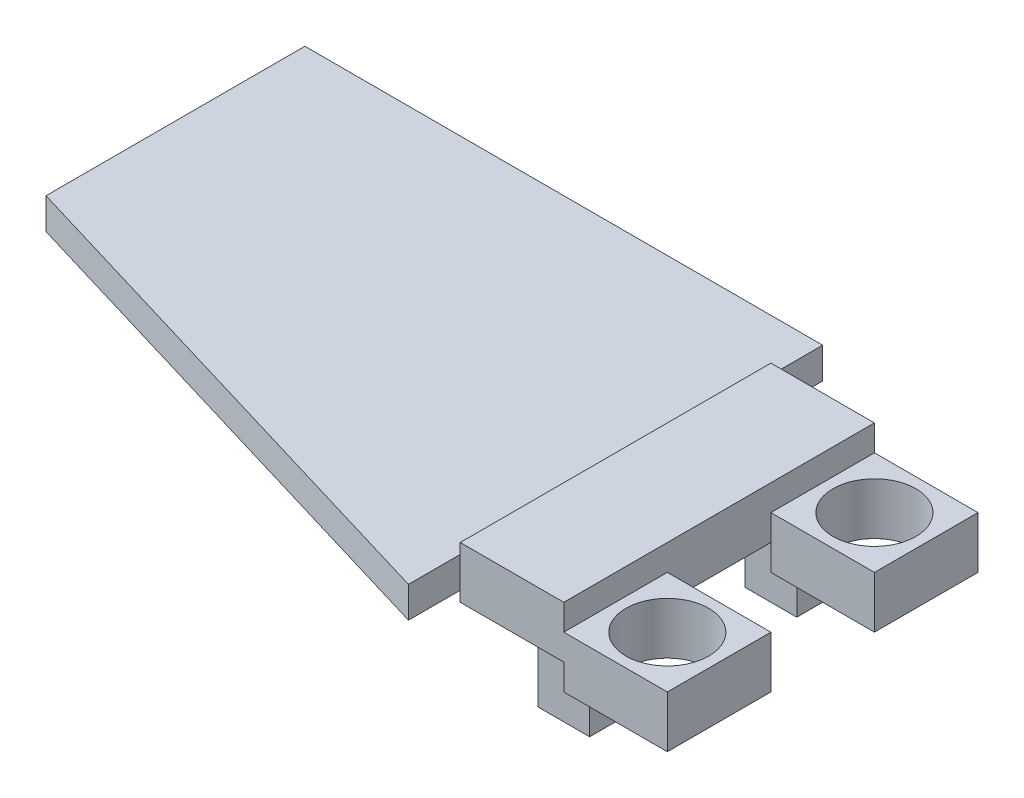
ISO-10303-21;
HEADER;
FILE_DESCRIPTION(('STEP AP214'),'2;1');
FILE_NAME('part.step','',(''),(''),'','','');
FILE_SCHEMA(('AUTOMOTIVE_DESIGN { 1 0 10303 214 1 1 1 1 }'));
ENDSEC;
DATA;
#1=APPLICATION_CONTEXT('core data for automotive mechanical design processes');
#2=APPLICATION_PROTOCOL_DEFINITION('international standard','automotive_design',2000,#1);
#3=PRODUCT_CONTEXT('',#1,'mechanical');
#4=PRODUCT('Part','Part','',(#3));
#5=PRODUCT_RELATED_PRODUCT_CATEGORY('part','',(#4));
#6=PRODUCT_DEFINITION_FORMATION('','',#4);
#7=PRODUCT_DEFINITION_CONTEXT('part definition',#1,'design');
#8=PRODUCT_DEFINITION('design','',#6,#7);
#9=PRODUCT_DEFINITION_SHAPE('','',#8);
#10=(LENGTH_UNIT() NAMED_UNIT(*) SI_UNIT(.MILLI.,.METRE.));
#11=(NAMED_UNIT(*) PLANE_ANGLE_UNIT() SI_UNIT($,.RADIAN.));
#12=(NAMED_UNIT(*) SI_UNIT($,.STERADIAN.) SOLID_ANGLE_UNIT());
#13=UNCERTAINTY_MEASURE_WITH_UNIT(LENGTH_MEASURE(1.E-05),#10,'distance_accuracy_value','');
#14=(GEOMETRIC_REPRESENTATION_CONTEXT(3) GLOBAL_UNCERTAINTY_ASSIGNED_CONTEXT((#13)) GLOBAL_UNIT_ASSIGNED_CONTEXT((#10,
#11,#12)) REPRESENTATION_CONTEXT('',''));
#15=CARTESIAN_POINT('',(0.,0.,0.));
#16=DIRECTION('',(0.,0.,1.));
#17=DIRECTION('',(1.,0.,0.));
#18=AXIS2_PLACEMENT_3D('',#15,#16,#17);
#19=CARTESIAN_POINT('',(-9.99999999999999,5.,-15.));
#20=DIRECTION('',(1.,0.,0.));
#21=DIRECTION('',(0.,0.,1.));
#22=AXIS2_PLACEMENT_3D('',#19,#20,#21);
#23=PLANE('',#22);
#24=DIRECTION('',(0.,0.,1.));
#25=VECTOR('',#24,1.);
#26=CARTESIAN_POINT('',(-10.,2.5,-25.));
#27=LINE('',#26,#25);
#28=CARTESIAN_POINT('',(-10.,2.5,-25.));
#29=VERTEX_POINT('',#28);
#30=CARTESIAN_POINT('',(-9.99999999999999,2.5,-22.5));
#31=VERTEX_POINT('',#30);
#32=EDGE_CURVE('E266',#29,#31,#27,.T.);
#33=ORIENTED_EDGE('',*,*,#32,.F.);
#34=DIRECTION('',(0.,-1.,0.));
#35=VECTOR('',#34,1.);
#36=CARTESIAN_POINT('',(-10.,5.,-25.));
#37=LINE('',#36,#35);
#38=CARTESIAN_POINT('',(-10.,0.,-25.));
#39=VERTEX_POINT('',#38);
#40=EDGE_CURVE('E454',#29,#39,#37,.T.);
#41=ORIENTED_EDGE('',*,*,#40,.T.);
#42=DIRECTION('',(0.,0.,-1.));
#43=VECTOR('',#42,1.);
#44=CARTESIAN_POINT('',(-9.99999999999999,0.,-15.));
#45=LINE('',#44,#43);
#46=CARTESIAN_POINT('',(-9.99999999999999,0.,-22.5));
#47=VERTEX_POINT('',#46);
#48=EDGE_CURVE('E447',#47,#39,#45,.T.);
#49=ORIENTED_EDGE('',*,*,#48,.F.);
#50=DIRECTION('',(0.,1.,0.));
#51=VECTOR('',#50,1.);
#52=CARTESIAN_POINT('',(-9.99999999999999,-5.,-22.5));
#53=LINE('',#52,#51);
#54=EDGE_CURVE('E354',#47,#31,#53,.T.);
#55=ORIENTED_EDGE('',*,*,#54,.T.);
#56=EDGE_LOOP('',(#33,#41,#49,#55));
#57=FACE_BOUND('',#56,.T.);
#58=ADVANCED_FACE('F39',(#57),#23,.F.);
#59=CARTESIAN_POINT('',(-9.99999999999999,2.5,-17.5));
#60=VERTEX_POINT('',#59);
#61=CARTESIAN_POINT('',(-9.99999999999999,2.5,-15.));
#62=VERTEX_POINT('',#61);
#63=EDGE_CURVE('E269',#60,#62,#27,.T.);
#64=ORIENTED_EDGE('',*,*,#63,.F.);
#65=DIRECTION('',(0.,-1.,0.));
#66=VECTOR('',#65,1.);
#67=CARTESIAN_POINT('',(-9.99999999999999,-5.,-17.5));
#68=LINE('',#67,#66);
#69=CARTESIAN_POINT('',(-9.99999999999999,0.,-17.5));
#70=VERTEX_POINT('',#69);
#71=EDGE_CURVE('E371',#60,#70,#68,.T.);
#72=ORIENTED_EDGE('',*,*,#71,.T.);
#73=CARTESIAN_POINT('',(-9.99999999999999,0.,-15.));
#74=VERTEX_POINT('',#73);
#75=EDGE_CURVE('E448',#74,#70,#45,.T.);
#76=ORIENTED_EDGE('',*,*,#75,.F.);
#77=DIRECTION('',(0.,-1.,0.));
#78=VECTOR('',#77,1.);
#79=CARTESIAN_POINT('',(-9.99999999999999,5.,-15.));
#80=LINE('',#79,#78);
#81=EDGE_CURVE('E457',#62,#74,#80,.T.);
#82=ORIENTED_EDGE('',*,*,#81,.F.);
#83=EDGE_LOOP('',(#64,#72,#76,#82));
#84=FACE_BOUND('',#83,.T.);
#85=ADVANCED_FACE('F550',(#84),#23,.F.);
#86=CARTESIAN_POINT('',(0.,3.5,0.));
#87=DIRECTION('',(0.,-1.,0.));
#88=DIRECTION('',(0.,0.,-1.));
#89=AXIS2_PLACEMENT_3D('',#86,#87,#88);
#90=PLANE('',#89);
#91=DIRECTION('',(0.,0.,-1.));
#92=VECTOR('',#91,1.);
#93=CARTESIAN_POINT('',(-19.9999999997544,3.5,291573.5));
#94=LINE('',#93,#92);
#95=CARTESIAN_POINT('',(-19.9999999999567,3.5,9.99999999993406));
#96=VERTEX_POINT('',#95);
#97=CARTESIAN_POINT('',(-19.9999999999818,3.5,4.99999999999545));
#98=VERTEX_POINT('',#97);
#99=EDGE_CURVE('E406',#96,#98,#94,.T.);
#100=ORIENTED_EDGE('',*,*,#99,.F.);
#101=DIRECTION('',(0.957826285221151,0.,0.287347885566345));
#102=VECTOR('',#101,1.);
#103=CARTESIAN_POINT('',(447203.899082569,3.5,134177.169724771));
#104=LINE('',#103,#102);
#105=CARTESIAN_POINT('',(-69.9999999999932,3.5,-5.0000000000523));
#106=VERTEX_POINT('',#105);
#107=EDGE_CURVE('E403',#106,#96,#104,.T.);
#108=ORIENTED_EDGE('',*,*,#107,.F.);
#109=DIRECTION('',(0.,0.,1.));
#110=VECTOR('',#109,1.);
#111=CARTESIAN_POINT('',(-69.9999999999932,3.5,291573.5));
#112=LINE('',#111,#110);
#113=CARTESIAN_POINT('',(-69.9999999999932,3.5,-29.9999999999727));
#114=VERTEX_POINT('',#113);
#115=EDGE_CURVE('E400',#114,#106,#112,.T.);
#116=ORIENTED_EDGE('',*,*,#115,.F.);
#117=DIRECTION('',(-1.,0.,0.));
#118=VECTOR('',#117,1.);
#119=CARTESIAN_POINT('',(399985.,3.5,-29.9999999999727));
#120=LINE('',#119,#118);
#121=CARTESIAN_POINT('',(-19.9999999999818,3.5,-29.9999999999727));
#122=VERTEX_POINT('',#121);
#123=EDGE_CURVE('E380',#122,#114,#120,.T.);
#124=ORIENTED_EDGE('',*,*,#123,.F.);
#125=DIRECTION('',(0.,0.,-1.));
#126=VECTOR('',#125,1.);
#127=CARTESIAN_POINT('',(-19.9999999999818,3.5,291573.5));
#128=LINE('',#127,#126);
#129=CARTESIAN_POINT('',(-19.9999999999818,3.5,-24.9999999999773));
#130=VERTEX_POINT('',#129);
#131=EDGE_CURVE('E385',#130,#122,#128,.T.);
#132=ORIENTED_EDGE('',*,*,#131,.F.);
#133=DIRECTION('',(0.,0.,-1.));
#134=VECTOR('',#133,1.);
#135=CARTESIAN_POINT('',(-20.,3.5,0.));
#136=LINE('',#135,#134);
#137=EDGE_CURVE('E351',#98,#130,#136,.T.);
#138=ORIENTED_EDGE('',*,*,#137,.F.);
#139=EDGE_LOOP('',(#100,#108,#116,#124,#132,#138));
#140=FACE_BOUND('',#139,.T.);
#141=ADVANCED_FACE('F552',(#140),#90,.T.);
#142=CARTESIAN_POINT('',(0.,6.5,0.));
#143=DIRECTION('',(0.,-1.,0.));
#144=DIRECTION('',(0.,0.,-1.));
#145=AXIS2_PLACEMENT_3D('',#142,#143,#144);
#146=PLANE('',#145);
#147=DIRECTION('',(0.,0.,-1.));
#148=VECTOR('',#147,1.);
#149=CARTESIAN_POINT('',(-20.,6.5,0.));
#150=LINE('',#149,#148);
#151=CARTESIAN_POINT('',(-20.,6.5,5.));
#152=VERTEX_POINT('',#151);
#153=CARTESIAN_POINT('',(-19.9999999999818,6.5,-24.9999999999773));
#154=VERTEX_POINT('',#153);
#155=EDGE_CURVE('E11',#152,#154,#150,.T.);
#156=ORIENTED_EDGE('',*,*,#155,.T.);
#157=DIRECTION('',(0.,0.,-1.));
#158=VECTOR('',#157,1.);
#159=CARTESIAN_POINT('',(-19.9999999999818,6.5,291573.5));
#160=LINE('',#159,#158);
#161=CARTESIAN_POINT('',(-19.9999999999818,6.5,-29.9999999999727));
#162=VERTEX_POINT('',#161);
#163=EDGE_CURVE('E394',#154,#162,#160,.T.);
#164=ORIENTED_EDGE('',*,*,#163,.T.);
#165=DIRECTION('',(-1.,0.,0.));
#166=VECTOR('',#165,1.);
#167=CARTESIAN_POINT('',(399985.,6.5,-29.9999999999727));
#168=LINE('',#167,#166);
#169=CARTESIAN_POINT('',(-69.9999999999932,6.5,-29.9999999999727));
#170=VERTEX_POINT('',#169);
#171=EDGE_CURVE('E381',#162,#170,#168,.T.);
#172=ORIENTED_EDGE('',*,*,#171,.T.);
#173=DIRECTION('',(0.,0.,1.));
#174=VECTOR('',#173,1.);
#175=CARTESIAN_POINT('',(-69.9999999999932,6.5,291573.5));
#176=LINE('',#175,#174);
#177=CARTESIAN_POINT('',(-69.9999999999932,6.5,-5.0000000000523));
#178=VERTEX_POINT('',#177);
#179=EDGE_CURVE('E384',#170,#178,#176,.T.);
#180=ORIENTED_EDGE('',*,*,#179,.T.);
#181=DIRECTION('',(0.957826285221151,0.,0.287347885566345));
#182=VECTOR('',#181,1.);
#183=CARTESIAN_POINT('',(447203.899082569,6.5,134177.169724771));
#184=LINE('',#183,#182);
#185=CARTESIAN_POINT('',(-19.9999999999567,6.5,9.99999999993406));
#186=VERTEX_POINT('',#185);
#187=EDGE_CURVE('E388',#178,#186,#184,.T.);
#188=ORIENTED_EDGE('',*,*,#187,.T.);
#189=DIRECTION('',(0.,0.,-1.));
#190=VECTOR('',#189,1.);
#191=CARTESIAN_POINT('',(-19.9999999997544,6.5,291573.5));
#192=LINE('',#191,#190);
#193=EDGE_CURVE('E391',#186,#152,#192,.T.);
#194=ORIENTED_EDGE('',*,*,#193,.T.);
#195=EDGE_LOOP('',(#156,#164,#172,#180,#188,#194));
#196=FACE_BOUND('',#195,.T.);
#197=ADVANCED_FACE('F558',(#196),#146,.F.);
#198=CARTESIAN_POINT('',(-15.,-5.,-22.5));
#199=DIRECTION('',(0.,0.,1.));
#200=DIRECTION('',(-1.,0.,0.));
#201=AXIS2_PLACEMENT_3D('',#198,#199,#200);
#202=PLANE('',#201);
#203=DIRECTION('',(1.,0.,0.));
#204=VECTOR('',#203,1.);
#205=CARTESIAN_POINT('',(-15.,2.5,-22.5));
#206=LINE('',#205,#204);
#207=CARTESIAN_POINT('',(-15.,2.5,-22.5));
#208=VERTEX_POINT('',#207);
#209=EDGE_CURVE('E349',#208,#31,#206,.T.);
#210=ORIENTED_EDGE('',*,*,#209,.T.);
#211=ORIENTED_EDGE('',*,*,#54,.F.);
#212=CARTESIAN_POINT('',(-9.99999999999999,-5.,-22.5));
#213=VERTEX_POINT('',#212);
#214=EDGE_CURVE('E365',#213,#47,#53,.T.);
#215=ORIENTED_EDGE('',*,*,#214,.F.);
#216=DIRECTION('',(1.,0.,0.));
#217=VECTOR('',#216,1.);
#218=CARTESIAN_POINT('',(-15.,-5.,-22.5));
#219=LINE('',#218,#217);
#220=CARTESIAN_POINT('',(-15.,-5.,-22.5));
#221=VERTEX_POINT('',#220);
#222=EDGE_CURVE('E364',#221,#213,#219,.T.);
#223=ORIENTED_EDGE('',*,*,#222,.F.);
#224=DIRECTION('',(0.,1.,0.));
#225=VECTOR('',#224,1.);
#226=CARTESIAN_POINT('',(-15.,-5.,-22.5));
#227=LINE('',#226,#225);
#228=EDGE_CURVE('E355',#221,#208,#227,.T.);
#229=ORIENTED_EDGE('',*,*,#228,.T.);
#230=EDGE_LOOP('',(#210,#211,#215,#223,#229));
#231=FACE_BOUND('',#230,.T.);
#232=ADVANCED_FACE('F468',(#231),#202,.F.);
#233=CARTESIAN_POINT('',(-15.,-5.,-17.5));
#234=DIRECTION('',(0.,0.,-1.));
#235=DIRECTION('',(1.,0.,0.));
#236=AXIS2_PLACEMENT_3D('',#233,#234,#235);
#237=PLANE('',#236);
#238=DIRECTION('',(-1.,0.,0.));
#239=VECTOR('',#238,1.);
#240=CARTESIAN_POINT('',(-15.,2.5,-17.5));
#241=LINE('',#240,#239);
#242=CARTESIAN_POINT('',(-15.,2.5,-17.5));
#243=VERTEX_POINT('',#242);
#244=EDGE_CURVE('E346',#60,#243,#241,.T.);
#245=ORIENTED_EDGE('',*,*,#244,.T.);
#246=DIRECTION('',(0.,-1.,0.));
#247=VECTOR('',#246,1.);
#248=CARTESIAN_POINT('',(-15.,-5.,-17.5));
#249=LINE('',#248,#247);
#250=CARTESIAN_POINT('',(-15.,-5.,-17.5));
#251=VERTEX_POINT('',#250);
#252=EDGE_CURVE('E358',#243,#251,#249,.T.);
#253=ORIENTED_EDGE('',*,*,#252,.T.);
#254=DIRECTION('',(1.,0.,0.));
#255=VECTOR('',#254,1.);
#256=CARTESIAN_POINT('',(-15.,-5.,-17.5));
#257=LINE('',#256,#255);
#258=CARTESIAN_POINT('',(-9.99999999999999,-5.,-17.5));
#259=VERTEX_POINT('',#258);
#260=EDGE_CURVE('E375',#251,#259,#257,.T.);
#261=ORIENTED_EDGE('',*,*,#260,.T.);
#262=EDGE_CURVE('E368',#70,#259,#68,.T.);
#263=ORIENTED_EDGE('',*,*,#262,.F.);
#264=ORIENTED_EDGE('',*,*,#71,.F.);
#265=EDGE_LOOP('',(#245,#253,#261,#263,#264));
#266=FACE_BOUND('',#265,.T.);
#267=ADVANCED_FACE('F484',(#266),#237,.F.);
#268=CARTESIAN_POINT('',(-15.,0.,0.));
#269=DIRECTION('',(1.,0.,0.));
#270=DIRECTION('',(0.,0.,1.));
#271=AXIS2_PLACEMENT_3D('',#268,#269,#270);
#272=PLANE('',#271);
#273=DIRECTION('',(0.,0.,-1.));
#274=VECTOR('',#273,1.);
#275=CARTESIAN_POINT('',(-15.,2.5,0.));
#276=LINE('',#275,#274);
#277=EDGE_CURVE('E47',#243,#208,#276,.T.);
#278=ORIENTED_EDGE('',*,*,#277,.T.);
#279=ORIENTED_EDGE('',*,*,#228,.F.);
#280=DIRECTION('',(0.,0.,-1.));
#281=VECTOR('',#280,1.);
#282=CARTESIAN_POINT('',(-15.,-5.,-17.5));
#283=LINE('',#282,#281);
#284=EDGE_CURVE('E362',#251,#221,#283,.T.);
#285=ORIENTED_EDGE('',*,*,#284,.F.);
#286=ORIENTED_EDGE('',*,*,#252,.F.);
#287=EDGE_LOOP('',(#278,#279,#285,#286));
#288=FACE_BOUND('',#287,.T.);
#289=ADVANCED_FACE('F464',(#288),#272,.F.);
#290=CARTESIAN_POINT('',(0.,5.,0.));
#291=DIRECTION('',(0.,-1.,0.));
#292=DIRECTION('',(0.,0.,-1.));
#293=AXIS2_PLACEMENT_3D('',#290,#291,#292);
#294=PLANE('',#293);
#295=DIRECTION('',(0.,0.,1.));
#296=VECTOR('',#295,1.);
#297=CARTESIAN_POINT('',(0.,5.,-15.));
#298=LINE('',#297,#296);
#299=CARTESIAN_POINT('',(0.,5.,-25.));
#300=VERTEX_POINT('',#299);
#301=CARTESIAN_POINT('',(0.,5.,-15.));
#302=VERTEX_POINT('',#301);
#303=EDGE_CURVE('E430',#300,#302,#298,.T.);
#304=ORIENTED_EDGE('',*,*,#303,.F.);
#305=DIRECTION('',(1.,0.,0.));
#306=VECTOR('',#305,1.);
#307=CARTESIAN_POINT('',(0.,5.,-25.));
#308=LINE('',#307,#306);
#309=CARTESIAN_POINT('',(-10.,5.,-25.));
#310=VERTEX_POINT('',#309);
#311=EDGE_CURVE('E439',#310,#300,#308,.T.);
#312=ORIENTED_EDGE('',*,*,#311,.F.);
#313=DIRECTION('',(0.,0.,-1.));
#314=VECTOR('',#313,1.);
#315=CARTESIAN_POINT('',(-9.99999999999999,5.,-15.));
#316=LINE('',#315,#314);
#317=CARTESIAN_POINT('',(-9.99999999999999,5.,-15.));
#318=VERTEX_POINT('',#317);
#319=EDGE_CURVE('E437',#318,#310,#316,.T.);
#320=ORIENTED_EDGE('',*,*,#319,.F.);
#321=DIRECTION('',(-1.,0.,0.));
#322=VECTOR('',#321,1.);
#323=CARTESIAN_POINT('',(0.,5.,-15.));
#324=LINE('',#323,#322);
#325=EDGE_CURVE('E433',#302,#318,#324,.T.);
#326=ORIENTED_EDGE('',*,*,#325,.F.);
#327=EDGE_LOOP('',(#304,#312,#320,#326));
#328=FACE_BOUND('',#327,.T.);
#329=CARTESIAN_POINT('',(-5.,5.,-20.));
#330=DIRECTION('',(0.,-1.,0.));
#331=DIRECTION('',(0.,0.,-1.));
#332=AXIS2_PLACEMENT_3D('',#329,#330,#331);
#333=CIRCLE('',#332,4.);
#334=CARTESIAN_POINT('',(-5.,5.,-24.));
#335=VERTEX_POINT('',#334);
#336=EDGE_CURVE('E424',#335,#335,#333,.T.);
#337=ORIENTED_EDGE('',*,*,#336,.T.);
#338=EDGE_LOOP('',(#337));
#339=FACE_BOUND('',#338,.T.);
#340=ADVANCED_FACE('F576',(#328,#339),#294,.F.);
#341=CARTESIAN_POINT('',(0.,0.,0.));
#342=DIRECTION('',(0.,-1.,0.));
#343=DIRECTION('',(0.,0.,-1.));
#344=AXIS2_PLACEMENT_3D('',#341,#342,#343);
#345=PLANE('',#344);
#346=DIRECTION('',(0.,0.,1.));
#347=VECTOR('',#346,1.);
#348=CARTESIAN_POINT('',(0.,0.,-15.));
#349=LINE('',#348,#347);
#350=CARTESIAN_POINT('',(0.,0.,-25.));
#351=VERTEX_POINT('',#350);
#352=CARTESIAN_POINT('',(0.,0.,-15.));
#353=VERTEX_POINT('',#352);
#354=EDGE_CURVE('E427',#351,#353,#349,.T.);
#355=ORIENTED_EDGE('',*,*,#354,.T.);
#356=DIRECTION('',(-1.,0.,0.));
#357=VECTOR('',#356,1.);
#358=CARTESIAN_POINT('',(0.,0.,-15.));
#359=LINE('',#358,#357);
#360=EDGE_CURVE('E445',#353,#74,#359,.T.);
#361=ORIENTED_EDGE('',*,*,#360,.T.);
#362=ORIENTED_EDGE('',*,*,#75,.T.);
#363=DIRECTION('',(0.,0.,-1.));
#364=VECTOR('',#363,1.);
#365=CARTESIAN_POINT('',(-10.,0.,0.));
#366=LINE('',#365,#364);
#367=EDGE_CURVE('E378',#70,#47,#366,.T.);
#368=ORIENTED_EDGE('',*,*,#367,.T.);
#369=ORIENTED_EDGE('',*,*,#48,.T.);
#370=DIRECTION('',(1.,0.,0.));
#371=VECTOR('',#370,1.);
#372=CARTESIAN_POINT('',(0.,0.,-25.));
#373=LINE('',#372,#371);
#374=EDGE_CURVE('E434',#39,#351,#373,.T.);
#375=ORIENTED_EDGE('',*,*,#374,.T.);
#376=EDGE_LOOP('',(#355,#361,#362,#368,#369,#375));
#377=FACE_BOUND('',#376,.T.);
#378=CARTESIAN_POINT('',(-5.,0.,-20.));
#379=DIRECTION('',(0.,-1.,0.));
#380=DIRECTION('',(0.,0.,-1.));
#381=AXIS2_PLACEMENT_3D('',#378,#379,#380);
#382=CIRCLE('',#381,4.);
#383=CARTESIAN_POINT('',(-5.,0.,-24.));
#384=VERTEX_POINT('',#383);
#385=EDGE_CURVE('E413',#384,#384,#382,.T.);
#386=ORIENTED_EDGE('',*,*,#385,.F.);
#387=EDGE_LOOP('',(#386));
#388=FACE_BOUND('',#387,.T.);
#389=ADVANCED_FACE('F545',(#377,#388),#345,.T.);
#390=CARTESIAN_POINT('',(0.,5.,-15.));
#391=DIRECTION('',(-1.,0.,0.));
#392=DIRECTION('',(0.,0.,-1.));
#393=AXIS2_PLACEMENT_3D('',#390,#391,#392);
#394=PLANE('',#393);
#395=ORIENTED_EDGE('',*,*,#354,.F.);
#396=DIRECTION('',(0.,-1.,0.));
#397=VECTOR('',#396,1.);
#398=CARTESIAN_POINT('',(0.,5.,-25.));
#399=LINE('',#398,#397);
#400=EDGE_CURVE('E442',#300,#351,#399,.T.);
#401=ORIENTED_EDGE('',*,*,#400,.F.);
#402=ORIENTED_EDGE('',*,*,#303,.T.);
#403=DIRECTION('',(0.,-1.,0.));
#404=VECTOR('',#403,1.);
#405=CARTESIAN_POINT('',(0.,5.,-15.));
#406=LINE('',#405,#404);
#407=EDGE_CURVE('E460',#302,#353,#406,.T.);
#408=ORIENTED_EDGE('',*,*,#407,.T.);
#409=EDGE_LOOP('',(#395,#401,#402,#408));
#410=FACE_BOUND('',#409,.T.);
#411=ADVANCED_FACE('F41',(#410),#394,.F.);
#412=CARTESIAN_POINT('',(0.,5.,-15.));
#413=DIRECTION('',(0.,0.,-1.));
#414=DIRECTION('',(1.,0.,0.));
#415=AXIS2_PLACEMENT_3D('',#412,#413,#414);
#416=PLANE('',#415);
#417=ORIENTED_EDGE('',*,*,#360,.F.);
#418=ORIENTED_EDGE('',*,*,#407,.F.);
#419=ORIENTED_EDGE('',*,*,#325,.T.);
#420=EDGE_CURVE('E458',#318,#62,#80,.T.);
#421=ORIENTED_EDGE('',*,*,#420,.T.);
#422=ORIENTED_EDGE('',*,*,#81,.T.);
#423=EDGE_LOOP('',(#417,#418,#419,#421,#422));
#424=FACE_BOUND('',#423,.T.);
#425=ADVANCED_FACE('F563',(#424),#416,.F.);
#426=CARTESIAN_POINT('',(0.,5.,-25.));
#427=DIRECTION('',(0.,0.,1.));
#428=DIRECTION('',(-1.,0.,0.));
#429=AXIS2_PLACEMENT_3D('',#426,#427,#428);
#430=PLANE('',#429);
#431=DIRECTION('',(0.,-1.,0.));
#432=VECTOR('',#431,1.);
#433=CARTESIAN_POINT('',(-19.9999999999818,6.5,-24.9999999999773));
#434=LINE('',#433,#432);
#435=EDGE_CURVE('E414',#154,#130,#434,.T.);
#436=ORIENTED_EDGE('',*,*,#435,.F.);
#437=DIRECTION('',(0.,-1.,0.));
#438=VECTOR('',#437,1.);
#439=CARTESIAN_POINT('',(-20.,7.5,-25.));
#440=LINE('',#439,#438);
#441=CARTESIAN_POINT('',(-20.,7.5,-25.));
#442=VERTEX_POINT('',#441);
#443=EDGE_CURVE('E274',#442,#154,#440,.T.);
#444=ORIENTED_EDGE('',*,*,#443,.F.);
#445=DIRECTION('',(1.,0.,0.));
#446=VECTOR('',#445,1.);
#447=CARTESIAN_POINT('',(-10.,7.5,-25.));
#448=LINE('',#447,#446);
#449=CARTESIAN_POINT('',(-10.,7.5,-25.));
#450=VERTEX_POINT('',#449);
#451=EDGE_CURVE('E263',#442,#450,#448,.T.);
#452=ORIENTED_EDGE('',*,*,#451,.T.);
#453=DIRECTION('',(0.,-1.,0.));
#454=VECTOR('',#453,1.);
#455=CARTESIAN_POINT('',(-9.99999999999091,6.5,-24.9999999999773));
#456=LINE('',#455,#454);
#457=EDGE_CURVE('E252',#450,#310,#456,.T.);
#458=ORIENTED_EDGE('',*,*,#457,.T.);
#459=ORIENTED_EDGE('',*,*,#311,.T.);
#460=ORIENTED_EDGE('',*,*,#400,.T.);
#461=ORIENTED_EDGE('',*,*,#374,.F.);
#462=ORIENTED_EDGE('',*,*,#40,.F.);
#463=DIRECTION('',(1.,0.,0.));
#464=VECTOR('',#463,1.);
#465=CARTESIAN_POINT('',(-10.,2.5,-25.));
#466=LINE('',#465,#464);
#467=CARTESIAN_POINT('',(-20.,2.5,-25.));
#468=VERTEX_POINT('',#467);
#469=EDGE_CURVE('E62',#468,#29,#466,.T.);
#470=ORIENTED_EDGE('',*,*,#469,.F.);
#471=EDGE_CURVE('E265',#130,#468,#440,.T.);
#472=ORIENTED_EDGE('',*,*,#471,.F.);
#473=EDGE_LOOP('',(#436,#444,#452,#458,#459,#460,#461,#462,#470,#472));
#474=FACE_BOUND('',#473,.T.);
#475=ADVANCED_FACE('F542',(#474),#430,.F.);
#476=CARTESIAN_POINT('',(-5.,5.,-20.));
#477=DIRECTION('',(0.,-1.,0.));
#478=DIRECTION('',(0.,0.,-1.));
#479=AXIS2_PLACEMENT_3D('',#476,#477,#478);
#480=CYLINDRICAL_SURFACE('',#479,4.);
#481=ORIENTED_EDGE('',*,*,#336,.F.);
#482=EDGE_LOOP('',(#481));
#483=FACE_BOUND('',#482,.T.);
#484=ORIENTED_EDGE('',*,*,#385,.T.);
#485=EDGE_LOOP('',(#484));
#486=FACE_BOUND('',#485,.T.);
#487=ADVANCED_FACE('F570',(#483,#486),#480,.F.);
#488=CARTESIAN_POINT('',(-9.99999999999091,6.5,291573.5));
#489=DIRECTION('',(1.,0.,0.));
#490=DIRECTION('',(0.,0.,1.));
#491=AXIS2_PLACEMENT_3D('',#488,#489,#490);
#492=PLANE('',#491);
#493=DIRECTION('',(0.,0.,-1.));
#494=VECTOR('',#493,1.);
#495=CARTESIAN_POINT('',(-10.,5.,-5.));
#496=LINE('',#495,#494);
#497=CARTESIAN_POINT('',(-9.99999999999091,5.,4.99999999999545));
#498=VERTEX_POINT('',#497);
#499=CARTESIAN_POINT('',(-9.99999999999091,5.,-4.99999999999545));
#500=VERTEX_POINT('',#499);
#501=EDGE_CURVE('E313',#498,#500,#496,.T.);
#502=ORIENTED_EDGE('',*,*,#501,.T.);
#503=DIRECTION('',(0.,-1.,0.));
#504=VECTOR('',#503,1.);
#505=CARTESIAN_POINT('',(-10.,5.,-5.));
#506=LINE('',#505,#504);
#507=CARTESIAN_POINT('',(-10.,2.5,-5.));
#508=VERTEX_POINT('',#507);
#509=EDGE_CURVE('E341',#500,#508,#506,.T.);
#510=ORIENTED_EDGE('',*,*,#509,.T.);
#511=EDGE_CURVE('E54',#62,#508,#27,.T.);
#512=ORIENTED_EDGE('',*,*,#511,.F.);
#513=ORIENTED_EDGE('',*,*,#420,.F.);
#514=ORIENTED_EDGE('',*,*,#319,.T.);
#515=ORIENTED_EDGE('',*,*,#457,.F.);
#516=DIRECTION('',(0.,0.,1.));
#517=VECTOR('',#516,1.);
#518=CARTESIAN_POINT('',(-10.,7.5,-25.));
#519=LINE('',#518,#517);
#520=CARTESIAN_POINT('',(-10.,7.5,5.));
#521=VERTEX_POINT('',#520);
#522=EDGE_CURVE('E236',#450,#521,#519,.T.);
#523=ORIENTED_EDGE('',*,*,#522,.T.);
#524=DIRECTION('',(0.,-1.,0.));
#525=VECTOR('',#524,1.);
#526=CARTESIAN_POINT('',(-9.99999999999091,6.5,4.99999999999545));
#527=LINE('',#526,#525);
#528=EDGE_CURVE('E244',#521,#498,#527,.T.);
#529=ORIENTED_EDGE('',*,*,#528,.T.);
#530=EDGE_LOOP('',(#502,#510,#512,#513,#514,#515,#523,#529));
#531=FACE_BOUND('',#530,.T.);
#532=ADVANCED_FACE('F255',(#531),#492,.T.);
#533=CARTESIAN_POINT('',(399985.,6.5,-29.9999999999727));
#534=DIRECTION('',(0.,0.,-1.));
#535=DIRECTION('',(1.,0.,0.));
#536=AXIS2_PLACEMENT_3D('',#533,#534,#535);
#537=PLANE('',#536);
#538=ORIENTED_EDGE('',*,*,#123,.T.);
#539=DIRECTION('',(0.,-1.,0.));
#540=VECTOR('',#539,1.);
#541=CARTESIAN_POINT('',(-69.9999999999932,6.5,-29.9999999999727));
#542=LINE('',#541,#540);
#543=EDGE_CURVE('E397',#170,#114,#542,.T.);
#544=ORIENTED_EDGE('',*,*,#543,.F.);
#545=ORIENTED_EDGE('',*,*,#171,.F.);
#546=DIRECTION('',(0.,-1.,0.));
#547=VECTOR('',#546,1.);
#548=CARTESIAN_POINT('',(-19.9999999999818,6.5,-29.9999999999727));
#549=LINE('',#548,#547);
#550=EDGE_CURVE('E411',#162,#122,#549,.T.);
#551=ORIENTED_EDGE('',*,*,#550,.T.);
#552=EDGE_LOOP('',(#538,#544,#545,#551));
#553=FACE_BOUND('',#552,.T.);
#554=ADVANCED_FACE('F598',(#553),#537,.T.);
#555=CARTESIAN_POINT('',(-19.9999999999818,6.5,291573.5));
#556=DIRECTION('',(1.,0.,0.));
#557=DIRECTION('',(0.,0.,1.));
#558=AXIS2_PLACEMENT_3D('',#555,#556,#557);
#559=PLANE('',#558);
#560=ORIENTED_EDGE('',*,*,#131,.T.);
#561=ORIENTED_EDGE('',*,*,#550,.F.);
#562=ORIENTED_EDGE('',*,*,#163,.F.);
#563=ORIENTED_EDGE('',*,*,#435,.T.);
#564=EDGE_LOOP('',(#560,#561,#562,#563));
#565=FACE_BOUND('',#564,.T.);
#566=ADVANCED_FACE('F594',(#565),#559,.T.);
#567=CARTESIAN_POINT('',(399985.,6.5,4.99999999999545));
#568=DIRECTION('',(0.,0.,1.));
#569=DIRECTION('',(-1.,0.,0.));
#570=AXIS2_PLACEMENT_3D('',#567,#568,#569);
#571=PLANE('',#570);
#572=DIRECTION('',(0.,-1.,0.));
#573=VECTOR('',#572,1.);
#574=CARTESIAN_POINT('',(-20.,7.5,5.));
#575=LINE('',#574,#573);
#576=CARTESIAN_POINT('',(-20.,2.5,5.));
#577=VERTEX_POINT('',#576);
#578=EDGE_CURVE('E276',#98,#577,#575,.T.);
#579=ORIENTED_EDGE('',*,*,#578,.T.);
#580=DIRECTION('',(-1.,0.,0.));
#581=VECTOR('',#580,1.);
#582=CARTESIAN_POINT('',(-10.,2.5,5.));
#583=LINE('',#582,#581);
#584=CARTESIAN_POINT('',(-10.,2.5,5.));
#585=VERTEX_POINT('',#584);
#586=EDGE_CURVE('E268',#585,#577,#583,.T.);
#587=ORIENTED_EDGE('',*,*,#586,.F.);
#588=DIRECTION('',(0.,-1.,0.));
#589=VECTOR('',#588,1.);
#590=CARTESIAN_POINT('',(-10.,5.,5.));
#591=LINE('',#590,#589);
#592=CARTESIAN_POINT('',(-10.,0.,5.));
#593=VERTEX_POINT('',#592);
#594=EDGE_CURVE('E321',#585,#593,#591,.T.);
#595=ORIENTED_EDGE('',*,*,#594,.T.);
#596=DIRECTION('',(-1.,0.,0.));
#597=VECTOR('',#596,1.);
#598=CARTESIAN_POINT('',(0.,0.,5.));
#599=LINE('',#598,#597);
#600=CARTESIAN_POINT('',(0.,0.,5.));
#601=VERTEX_POINT('',#600);
#602=EDGE_CURVE('E316',#601,#593,#599,.T.);
#603=ORIENTED_EDGE('',*,*,#602,.F.);
#604=DIRECTION('',(0.,-1.,0.));
#605=VECTOR('',#604,1.);
#606=CARTESIAN_POINT('',(0.,5.,5.));
#607=LINE('',#606,#605);
#608=CARTESIAN_POINT('',(0.,5.,5.));
#609=VERTEX_POINT('',#608);
#610=EDGE_CURVE('E334',#609,#601,#607,.T.);
#611=ORIENTED_EDGE('',*,*,#610,.F.);
#612=DIRECTION('',(-1.,0.,0.));
#613=VECTOR('',#612,1.);
#614=CARTESIAN_POINT('',(0.,5.,5.));
#615=LINE('',#614,#613);
#616=EDGE_CURVE('E249',#609,#498,#615,.T.);
#617=ORIENTED_EDGE('',*,*,#616,.T.);
#618=ORIENTED_EDGE('',*,*,#528,.F.);
#619=DIRECTION('',(-1.,0.,0.));
#620=VECTOR('',#619,1.);
#621=CARTESIAN_POINT('',(-10.,7.5,5.));
#622=LINE('',#621,#620);
#623=CARTESIAN_POINT('',(-20.,7.5,5.));
#624=VERTEX_POINT('',#623);
#625=EDGE_CURVE('E231',#521,#624,#622,.T.);
#626=ORIENTED_EDGE('',*,*,#625,.T.);
#627=EDGE_CURVE('E277',#624,#152,#575,.T.);
#628=ORIENTED_EDGE('',*,*,#627,.T.);
#629=DIRECTION('',(0.,-1.,0.));
#630=VECTOR('',#629,1.);
#631=CARTESIAN_POINT('',(-19.9999999999818,6.5,4.99999999999545));
#632=LINE('',#631,#630);
#633=EDGE_CURVE('E253',#152,#98,#632,.T.);
#634=ORIENTED_EDGE('',*,*,#633,.T.);
#635=EDGE_LOOP('',(#579,#587,#595,#603,#611,#617,#618,#626,#628,#634));
#636=FACE_BOUND('',#635,.T.);
#637=ADVANCED_FACE('F246',(#636),#571,.T.);
#638=CARTESIAN_POINT('',(-19.9999999997544,6.5,291573.5));
#639=DIRECTION('',(1.,0.,0.));
#640=DIRECTION('',(0.,0.,1.));
#641=AXIS2_PLACEMENT_3D('',#638,#639,#640);
#642=PLANE('',#641);
#643=ORIENTED_EDGE('',*,*,#99,.T.);
#644=ORIENTED_EDGE('',*,*,#633,.F.);
#645=ORIENTED_EDGE('',*,*,#193,.F.);
#646=DIRECTION('',(0.,-1.,0.));
#647=VECTOR('',#646,1.);
#648=CARTESIAN_POINT('',(-19.9999999999567,6.5,9.99999999993406));
#649=LINE('',#648,#647);
#650=EDGE_CURVE('E419',#186,#96,#649,.T.);
#651=ORIENTED_EDGE('',*,*,#650,.T.);
#652=EDGE_LOOP('',(#643,#644,#645,#651));
#653=FACE_BOUND('',#652,.T.);
#654=ADVANCED_FACE('F588',(#653),#642,.T.);
#655=CARTESIAN_POINT('',(447203.899082569,6.5,134177.169724771));
#656=DIRECTION('',(-0.287347885566345,0.,0.957826285221151));
#657=DIRECTION('',(-0.957826285221152,0.,-0.287347885566345));
#658=AXIS2_PLACEMENT_3D('',#655,#656,#657);
#659=PLANE('',#658);
#660=ORIENTED_EDGE('',*,*,#107,.T.);
#661=ORIENTED_EDGE('',*,*,#650,.F.);
#662=ORIENTED_EDGE('',*,*,#187,.F.);
#663=DIRECTION('',(0.,-1.,0.));
#664=VECTOR('',#663,1.);
#665=CARTESIAN_POINT('',(-69.9999999999932,6.5,-5.0000000000523));
#666=LINE('',#665,#664);
#667=EDGE_CURVE('E421',#178,#106,#666,.T.);
#668=ORIENTED_EDGE('',*,*,#667,.T.);
#669=EDGE_LOOP('',(#660,#661,#662,#668));
#670=FACE_BOUND('',#669,.T.);
#671=ADVANCED_FACE('F602',(#670),#659,.T.);
#672=CARTESIAN_POINT('',(-69.9999999999932,6.5,291573.5));
#673=DIRECTION('',(-1.,0.,0.));
#674=DIRECTION('',(0.,0.,-1.));
#675=AXIS2_PLACEMENT_3D('',#672,#673,#674);
#676=PLANE('',#675);
#677=ORIENTED_EDGE('',*,*,#115,.T.);
#678=ORIENTED_EDGE('',*,*,#667,.F.);
#679=ORIENTED_EDGE('',*,*,#179,.F.);
#680=ORIENTED_EDGE('',*,*,#543,.T.);
#681=EDGE_LOOP('',(#677,#678,#679,#680));
#682=FACE_BOUND('',#681,.T.);
#683=ADVANCED_FACE('F600',(#682),#676,.T.);
#684=CARTESIAN_POINT('',(-15.,-5.,-17.5));
#685=DIRECTION('',(0.,1.,0.));
#686=DIRECTION('',(0.,0.,1.));
#687=AXIS2_PLACEMENT_3D('',#684,#685,#686);
#688=PLANE('',#687);
#689=DIRECTION('',(0.,0.,-1.));
#690=VECTOR('',#689,1.);
#691=CARTESIAN_POINT('',(-9.99999999999999,-5.,-17.5));
#692=LINE('',#691,#690);
#693=EDGE_CURVE('E359',#259,#213,#692,.T.);
#694=ORIENTED_EDGE('',*,*,#693,.F.);
#695=ORIENTED_EDGE('',*,*,#260,.F.);
#696=ORIENTED_EDGE('',*,*,#284,.T.);
#697=ORIENTED_EDGE('',*,*,#222,.T.);
#698=EDGE_LOOP('',(#694,#695,#696,#697));
#699=FACE_BOUND('',#698,.T.);
#700=ADVANCED_FACE('F482',(#699),#688,.F.);
#701=CARTESIAN_POINT('',(-10.,0.,0.));
#702=DIRECTION('',(1.,0.,0.));
#703=DIRECTION('',(0.,0.,1.));
#704=AXIS2_PLACEMENT_3D('',#701,#702,#703);
#705=PLANE('',#704);
#706=ORIENTED_EDGE('',*,*,#262,.T.);
#707=ORIENTED_EDGE('',*,*,#693,.T.);
#708=ORIENTED_EDGE('',*,*,#214,.T.);
#709=ORIENTED_EDGE('',*,*,#367,.F.);
#710=EDGE_LOOP('',(#706,#707,#708,#709));
#711=FACE_BOUND('',#710,.T.);
#712=ADVANCED_FACE('F478',(#711),#705,.T.);
#713=CARTESIAN_POINT('',(-20.,7.5,-25.));
#714=DIRECTION('',(1.,0.,0.));
#715=DIRECTION('',(0.,0.,1.));
#716=AXIS2_PLACEMENT_3D('',#713,#714,#715);
#717=PLANE('',#716);
#718=ORIENTED_EDGE('',*,*,#137,.T.);
#719=ORIENTED_EDGE('',*,*,#471,.T.);
#720=DIRECTION('',(0.,0.,-1.));
#721=VECTOR('',#720,1.);
#722=CARTESIAN_POINT('',(-20.,2.5,-25.));
#723=LINE('',#722,#721);
#724=EDGE_CURVE('E259',#577,#468,#723,.T.);
#725=ORIENTED_EDGE('',*,*,#724,.F.);
#726=ORIENTED_EDGE('',*,*,#578,.F.);
#727=EDGE_LOOP('',(#718,#719,#725,#726));
#728=FACE_BOUND('',#727,.T.);
#729=ADVANCED_FACE('F537',(#728),#717,.F.);
#730=CARTESIAN_POINT('',(-10.,0.,0.));
#731=DIRECTION('',(1.,0.,0.));
#732=DIRECTION('',(0.,0.,1.));
#733=AXIS2_PLACEMENT_3D('',#730,#731,#732);
#734=PLANE('',#733);
#735=DIRECTION('',(0.,-1.,0.));
#736=VECTOR('',#735,1.);
#737=CARTESIAN_POINT('',(-10.,-5.,2.5));
#738=LINE('',#737,#736);
#739=CARTESIAN_POINT('',(-10.,0.,2.5));
#740=VERTEX_POINT('',#739);
#741=CARTESIAN_POINT('',(-10.,-5.,2.5));
#742=VERTEX_POINT('',#741);
#743=EDGE_CURVE('E297',#740,#742,#738,.T.);
#744=ORIENTED_EDGE('',*,*,#743,.T.);
#745=DIRECTION('',(0.,0.,-1.));
#746=VECTOR('',#745,1.);
#747=CARTESIAN_POINT('',(-10.,-5.,2.5));
#748=LINE('',#747,#746);
#749=CARTESIAN_POINT('',(-10.,-5.,-2.5));
#750=VERTEX_POINT('',#749);
#751=EDGE_CURVE('E289',#742,#750,#748,.T.);
#752=ORIENTED_EDGE('',*,*,#751,.T.);
#753=DIRECTION('',(0.,1.,0.));
#754=VECTOR('',#753,1.);
#755=CARTESIAN_POINT('',(-10.,-5.,-2.5));
#756=LINE('',#755,#754);
#757=CARTESIAN_POINT('',(-10.,0.,-2.5));
#758=VERTEX_POINT('',#757);
#759=EDGE_CURVE('E284',#750,#758,#756,.T.);
#760=ORIENTED_EDGE('',*,*,#759,.T.);
#761=DIRECTION('',(0.,0.,-1.));
#762=VECTOR('',#761,1.);
#763=CARTESIAN_POINT('',(-10.,0.,-5.));
#764=LINE('',#763,#762);
#765=EDGE_CURVE('E326',#740,#758,#764,.T.);
#766=ORIENTED_EDGE('',*,*,#765,.F.);
#767=EDGE_LOOP('',(#744,#752,#760,#766));
#768=FACE_BOUND('',#767,.T.);
#769=ADVANCED_FACE('F523',(#768),#734,.T.);
#770=CARTESIAN_POINT('',(-15.,-5.,2.49999999999999));
#771=DIRECTION('',(0.,1.,0.));
#772=DIRECTION('',(0.,0.,1.));
#773=AXIS2_PLACEMENT_3D('',#770,#771,#772);
#774=PLANE('',#773);
#775=ORIENTED_EDGE('',*,*,#751,.F.);
#776=DIRECTION('',(1.,0.,0.));
#777=VECTOR('',#776,1.);
#778=CARTESIAN_POINT('',(-15.,-5.,2.49999999999999));
#779=LINE('',#778,#777);
#780=CARTESIAN_POINT('',(-15.,-5.,2.49999999999999));
#781=VERTEX_POINT('',#780);
#782=EDGE_CURVE('E304',#781,#742,#779,.T.);
#783=ORIENTED_EDGE('',*,*,#782,.F.);
#784=DIRECTION('',(0.,0.,-1.));
#785=VECTOR('',#784,1.);
#786=CARTESIAN_POINT('',(-15.,-5.,2.49999999999999));
#787=LINE('',#786,#785);
#788=CARTESIAN_POINT('',(-15.,-5.,-2.5));
#789=VERTEX_POINT('',#788);
#790=EDGE_CURVE('E291',#781,#789,#787,.T.);
#791=ORIENTED_EDGE('',*,*,#790,.T.);
#792=DIRECTION('',(1.,0.,0.));
#793=VECTOR('',#792,1.);
#794=CARTESIAN_POINT('',(-15.,-5.,-2.5));
#795=LINE('',#794,#793);
#796=EDGE_CURVE('E294',#789,#750,#795,.T.);
#797=ORIENTED_EDGE('',*,*,#796,.T.);
#798=EDGE_LOOP('',(#775,#783,#791,#797));
#799=FACE_BOUND('',#798,.T.);
#800=ADVANCED_FACE('F728',(#799),#774,.F.);
#801=CARTESIAN_POINT('',(-5.,5.,0.));
#802=DIRECTION('',(0.,-1.,0.));
#803=DIRECTION('',(0.,0.,-1.));
#804=AXIS2_PLACEMENT_3D('',#801,#802,#803);
#805=CYLINDRICAL_SURFACE('',#804,4.);
#806=CARTESIAN_POINT('',(-5.,5.,0.));
#807=DIRECTION('',(0.,-1.,0.));
#808=DIRECTION('',(0.,0.,1.));
#809=AXIS2_PLACEMENT_3D('',#806,#807,#808);
#810=CIRCLE('',#809,4.);
#811=CARTESIAN_POINT('',(-5.,5.,4.));
#812=VERTEX_POINT('',#811);
#813=EDGE_CURVE('E307',#812,#812,#810,.T.);
#814=ORIENTED_EDGE('',*,*,#813,.F.);
#815=EDGE_LOOP('',(#814));
#816=FACE_BOUND('',#815,.T.);
#817=CARTESIAN_POINT('',(-5.,0.,0.));
#818=DIRECTION('',(0.,-1.,0.));
#819=DIRECTION('',(0.,0.,1.));
#820=AXIS2_PLACEMENT_3D('',#817,#818,#819);
#821=CIRCLE('',#820,4.);
#822=CARTESIAN_POINT('',(-5.,0.,4.));
#823=VERTEX_POINT('',#822);
#824=EDGE_CURVE('E306',#823,#823,#821,.T.);
#825=ORIENTED_EDGE('',*,*,#824,.T.);
#826=EDGE_LOOP('',(#825));
#827=FACE_BOUND('',#826,.T.);
#828=ADVANCED_FACE('F737',(#816,#827),#805,.F.);
#829=CARTESIAN_POINT('',(0.,5.,-5.));
#830=DIRECTION('',(-1.,0.,0.));
#831=DIRECTION('',(0.,0.,-1.));
#832=AXIS2_PLACEMENT_3D('',#829,#830,#831);
#833=PLANE('',#832);
#834=DIRECTION('',(0.,0.,1.));
#835=VECTOR('',#834,1.);
#836=CARTESIAN_POINT('',(0.,0.,-5.));
#837=LINE('',#836,#835);
#838=CARTESIAN_POINT('',(0.,0.,-5.));
#839=VERTEX_POINT('',#838);
#840=EDGE_CURVE('E328',#839,#601,#837,.T.);
#841=ORIENTED_EDGE('',*,*,#840,.F.);
#842=DIRECTION('',(0.,-1.,0.));
#843=VECTOR('',#842,1.);
#844=CARTESIAN_POINT('',(0.,5.,-5.));
#845=LINE('',#844,#843);
#846=CARTESIAN_POINT('',(0.,5.,-5.));
#847=VERTEX_POINT('',#846);
#848=EDGE_CURVE('E337',#847,#839,#845,.T.);
#849=ORIENTED_EDGE('',*,*,#848,.F.);
#850=DIRECTION('',(0.,0.,1.));
#851=VECTOR('',#850,1.);
#852=CARTESIAN_POINT('',(0.,5.,-5.));
#853=LINE('',#852,#851);
#854=EDGE_CURVE('E318',#847,#609,#853,.T.);
#855=ORIENTED_EDGE('',*,*,#854,.T.);
#856=ORIENTED_EDGE('',*,*,#610,.T.);
#857=EDGE_LOOP('',(#841,#849,#855,#856));
#858=FACE_BOUND('',#857,.T.);
#859=ADVANCED_FACE('F532',(#858),#833,.F.);
#860=CARTESIAN_POINT('',(0.,5.,-5.));
#861=DIRECTION('',(0.,0.,1.));
#862=DIRECTION('',(-1.,0.,0.));
#863=AXIS2_PLACEMENT_3D('',#860,#861,#862);
#864=PLANE('',#863);
#865=DIRECTION('',(1.,0.,0.));
#866=VECTOR('',#865,1.);
#867=CARTESIAN_POINT('',(0.,0.,-5.));
#868=LINE('',#867,#866);
#869=CARTESIAN_POINT('',(-10.,0.,-5.));
#870=VERTEX_POINT('',#869);
#871=EDGE_CURVE('E325',#870,#839,#868,.T.);
#872=ORIENTED_EDGE('',*,*,#871,.F.);
#873=EDGE_CURVE('E340',#508,#870,#506,.T.);
#874=ORIENTED_EDGE('',*,*,#873,.F.);
#875=ORIENTED_EDGE('',*,*,#509,.F.);
#876=DIRECTION('',(1.,0.,0.));
#877=VECTOR('',#876,1.);
#878=CARTESIAN_POINT('',(0.,5.,-5.));
#879=LINE('',#878,#877);
#880=EDGE_CURVE('E315',#500,#847,#879,.T.);
#881=ORIENTED_EDGE('',*,*,#880,.T.);
#882=ORIENTED_EDGE('',*,*,#848,.T.);
#883=EDGE_LOOP('',(#872,#874,#875,#881,#882));
#884=FACE_BOUND('',#883,.T.);
#885=ADVANCED_FACE('F527',(#884),#864,.F.);
#886=CARTESIAN_POINT('',(0.,0.,0.));
#887=DIRECTION('',(0.,1.,0.));
#888=DIRECTION('',(0.,0.,1.));
#889=AXIS2_PLACEMENT_3D('',#886,#887,#888);
#890=PLANE('',#889);
#891=EDGE_CURVE('E322',#593,#740,#764,.T.);
#892=ORIENTED_EDGE('',*,*,#891,.T.);
#893=ORIENTED_EDGE('',*,*,#765,.T.);
#894=EDGE_CURVE('E310',#758,#870,#764,.T.);
#895=ORIENTED_EDGE('',*,*,#894,.T.);
#896=ORIENTED_EDGE('',*,*,#871,.T.);
#897=ORIENTED_EDGE('',*,*,#840,.T.);
#898=ORIENTED_EDGE('',*,*,#602,.T.);
#899=EDGE_LOOP('',(#892,#893,#895,#896,#897,#898));
#900=FACE_BOUND('',#899,.T.);
#901=ORIENTED_EDGE('',*,*,#824,.F.);
#902=EDGE_LOOP('',(#901));
#903=FACE_BOUND('',#902,.T.);
#904=ADVANCED_FACE('F519',(#900,#903),#890,.F.);
#905=CARTESIAN_POINT('',(-15.,0.,0.));
#906=DIRECTION('',(1.,0.,0.));
#907=DIRECTION('',(0.,0.,1.));
#908=AXIS2_PLACEMENT_3D('',#905,#906,#907);
#909=PLANE('',#908);
#910=DIRECTION('',(0.,0.,-1.));
#911=VECTOR('',#910,1.);
#912=CARTESIAN_POINT('',(-15.,2.5,0.));
#913=LINE('',#912,#911);
#914=CARTESIAN_POINT('',(-15.,2.5,2.49999999999999));
#915=VERTEX_POINT('',#914);
#916=CARTESIAN_POINT('',(-15.,2.5,-2.5));
#917=VERTEX_POINT('',#916);
#918=EDGE_CURVE('E343',#915,#917,#913,.T.);
#919=ORIENTED_EDGE('',*,*,#918,.T.);
#920=DIRECTION('',(0.,1.,0.));
#921=VECTOR('',#920,1.);
#922=CARTESIAN_POINT('',(-15.,-5.,-2.5));
#923=LINE('',#922,#921);
#924=EDGE_CURVE('E285',#789,#917,#923,.T.);
#925=ORIENTED_EDGE('',*,*,#924,.F.);
#926=ORIENTED_EDGE('',*,*,#790,.F.);
#927=DIRECTION('',(0.,-1.,0.));
#928=VECTOR('',#927,1.);
#929=CARTESIAN_POINT('',(-15.,-5.,2.49999999999999));
#930=LINE('',#929,#928);
#931=EDGE_CURVE('E288',#915,#781,#930,.T.);
#932=ORIENTED_EDGE('',*,*,#931,.F.);
#933=EDGE_LOOP('',(#919,#925,#926,#932));
#934=FACE_BOUND('',#933,.T.);
#935=ADVANCED_FACE('F509',(#934),#909,.F.);
#936=CARTESIAN_POINT('',(-15.,-5.,2.49999999999999));
#937=DIRECTION('',(0.,0.,-1.));
#938=DIRECTION('',(1.,0.,0.));
#939=AXIS2_PLACEMENT_3D('',#936,#937,#938);
#940=PLANE('',#939);
#941=DIRECTION('',(-1.,0.,0.));
#942=VECTOR('',#941,1.);
#943=CARTESIAN_POINT('',(-15.,2.5,2.49999999999999));
#944=LINE('',#943,#942);
#945=CARTESIAN_POINT('',(-10.,2.5,2.5));
#946=VERTEX_POINT('',#945);
#947=EDGE_CURVE('E279',#946,#915,#944,.T.);
#948=ORIENTED_EDGE('',*,*,#947,.T.);
#949=ORIENTED_EDGE('',*,*,#931,.T.);
#950=ORIENTED_EDGE('',*,*,#782,.T.);
#951=ORIENTED_EDGE('',*,*,#743,.F.);
#952=EDGE_CURVE('E299',#946,#740,#738,.T.);
#953=ORIENTED_EDGE('',*,*,#952,.F.);
#954=EDGE_LOOP('',(#948,#949,#950,#951,#953));
#955=FACE_BOUND('',#954,.T.);
#956=ADVANCED_FACE('F512',(#955),#940,.F.);
#957=CARTESIAN_POINT('',(-15.,-5.,-2.5));
#958=DIRECTION('',(0.,0.,1.));
#959=DIRECTION('',(-1.,0.,0.));
#960=AXIS2_PLACEMENT_3D('',#957,#958,#959);
#961=PLANE('',#960);
#962=DIRECTION('',(1.,0.,0.));
#963=VECTOR('',#962,1.);
#964=CARTESIAN_POINT('',(-15.,2.5,-2.5));
#965=LINE('',#964,#963);
#966=CARTESIAN_POINT('',(-10.,2.5,-2.5));
#967=VERTEX_POINT('',#966);
#968=EDGE_CURVE('E281',#917,#967,#965,.T.);
#969=ORIENTED_EDGE('',*,*,#968,.T.);
#970=EDGE_CURVE('E298',#758,#967,#756,.T.);
#971=ORIENTED_EDGE('',*,*,#970,.F.);
#972=ORIENTED_EDGE('',*,*,#759,.F.);
#973=ORIENTED_EDGE('',*,*,#796,.F.);
#974=ORIENTED_EDGE('',*,*,#924,.T.);
#975=EDGE_LOOP('',(#969,#971,#972,#973,#974));
#976=FACE_BOUND('',#975,.T.);
#977=ADVANCED_FACE('F504',(#976),#961,.F.);
#978=CARTESIAN_POINT('',(0.,5.,0.));
#979=DIRECTION('',(0.,1.,0.));
#980=DIRECTION('',(0.,0.,1.));
#981=AXIS2_PLACEMENT_3D('',#978,#979,#980);
#982=PLANE('',#981);
#983=ORIENTED_EDGE('',*,*,#813,.T.);
#984=EDGE_LOOP('',(#983));
#985=FACE_BOUND('',#984,.T.);
#986=ORIENTED_EDGE('',*,*,#501,.F.);
#987=ORIENTED_EDGE('',*,*,#616,.F.);
#988=ORIENTED_EDGE('',*,*,#854,.F.);
#989=ORIENTED_EDGE('',*,*,#880,.F.);
#990=EDGE_LOOP('',(#986,#987,#988,#989));
#991=FACE_BOUND('',#990,.T.);
#992=ADVANCED_FACE('F796',(#985,#991),#982,.T.);
#993=CARTESIAN_POINT('',(-10.,5.,-5.));
#994=DIRECTION('',(1.,0.,0.));
#995=DIRECTION('',(0.,0.,1.));
#996=AXIS2_PLACEMENT_3D('',#993,#994,#995);
#997=PLANE('',#996);
#998=EDGE_CURVE('E491',#946,#585,#27,.T.);
#999=ORIENTED_EDGE('',*,*,#998,.F.);
#1000=ORIENTED_EDGE('',*,*,#952,.T.);
#1001=ORIENTED_EDGE('',*,*,#891,.F.);
#1002=ORIENTED_EDGE('',*,*,#594,.F.);
#1003=EDGE_LOOP('',(#999,#1000,#1001,#1002));
#1004=FACE_BOUND('',#1003,.T.);
#1005=ADVANCED_FACE('F516',(#1004),#997,.F.);
#1006=EDGE_CURVE('E270',#508,#967,#27,.T.);
#1007=ORIENTED_EDGE('',*,*,#1006,.F.);
#1008=ORIENTED_EDGE('',*,*,#873,.T.);
#1009=ORIENTED_EDGE('',*,*,#894,.F.);
#1010=ORIENTED_EDGE('',*,*,#970,.T.);
#1011=EDGE_LOOP('',(#1007,#1008,#1009,#1010));
#1012=FACE_BOUND('',#1011,.T.);
#1013=ADVANCED_FACE('F500',(#1012),#997,.F.);
#1014=CARTESIAN_POINT('',(0.,2.5,0.));
#1015=DIRECTION('',(0.,1.,0.));
#1016=DIRECTION('',(0.,0.,1.));
#1017=AXIS2_PLACEMENT_3D('',#1014,#1015,#1016);
#1018=PLANE('',#1017);
#1019=ORIENTED_EDGE('',*,*,#277,.F.);
#1020=ORIENTED_EDGE('',*,*,#244,.F.);
#1021=ORIENTED_EDGE('',*,*,#63,.T.);
#1022=ORIENTED_EDGE('',*,*,#511,.T.);
#1023=ORIENTED_EDGE('',*,*,#1006,.T.);
#1024=ORIENTED_EDGE('',*,*,#968,.F.);
#1025=ORIENTED_EDGE('',*,*,#918,.F.);
#1026=ORIENTED_EDGE('',*,*,#947,.F.);
#1027=ORIENTED_EDGE('',*,*,#998,.T.);
#1028=ORIENTED_EDGE('',*,*,#586,.T.);
#1029=ORIENTED_EDGE('',*,*,#724,.T.);
#1030=ORIENTED_EDGE('',*,*,#469,.T.);
#1031=ORIENTED_EDGE('',*,*,#32,.T.);
#1032=ORIENTED_EDGE('',*,*,#209,.F.);
#1033=EDGE_LOOP('',(#1019,#1020,#1021,#1022,#1023,#1024,#1025,#1026,#1027,#1028,#1029,#1030,
#1031,#1032));
#1034=FACE_BOUND('',#1033,.T.);
#1035=ADVANCED_FACE('F472',(#1034),#1018,.F.);
#1036=ORIENTED_EDGE('',*,*,#627,.F.);
#1037=DIRECTION('',(0.,0.,-1.));
#1038=VECTOR('',#1037,1.);
#1039=CARTESIAN_POINT('',(-20.,7.5,-25.));
#1040=LINE('',#1039,#1038);
#1041=EDGE_CURVE('E238',#624,#442,#1040,.T.);
#1042=ORIENTED_EDGE('',*,*,#1041,.T.);
#1043=ORIENTED_EDGE('',*,*,#443,.T.);
#1044=ORIENTED_EDGE('',*,*,#155,.F.);
#1045=EDGE_LOOP('',(#1036,#1042,#1043,#1044));
#1046=FACE_BOUND('',#1045,.T.);
#1047=ADVANCED_FACE('F583',(#1046),#717,.F.);
#1048=CARTESIAN_POINT('',(0.,7.5,0.));
#1049=DIRECTION('',(0.,1.,0.));
#1050=DIRECTION('',(0.,0.,1.));
#1051=AXIS2_PLACEMENT_3D('',#1048,#1049,#1050);
#1052=PLANE('',#1051);
#1053=ORIENTED_EDGE('',*,*,#522,.F.);
#1054=ORIENTED_EDGE('',*,*,#451,.F.);
#1055=ORIENTED_EDGE('',*,*,#1041,.F.);
#1056=ORIENTED_EDGE('',*,*,#625,.F.);
#1057=EDGE_LOOP('',(#1053,#1054,#1055,#1056));
#1058=FACE_BOUND('',#1057,.T.);
#1059=ADVANCED_FACE('F233',(#1058),#1052,.T.);
#1060=CLOSED_SHELL('',(#58,#85,#141,#197,#232,#267,#289,#340,#389,#411,#425,#475,#487,#532,#554,
#566,#637,#654,#671,#683,#700,#712,#729,#769,#800,#828,#859,#885,#904,#935,#956,#977,#992,#1005,
#1013,#1035,#1047,#1059));
#1061=MANIFOLD_SOLID_BREP('B2',#1060);
#1062=ADVANCED_BREP_SHAPE_REPRESENTATION('',(#18,#1061),#14);
#1063=SHAPE_DEFINITION_REPRESENTATION(#9,#1062);
ENDSEC;
END-ISO-10303-21;
